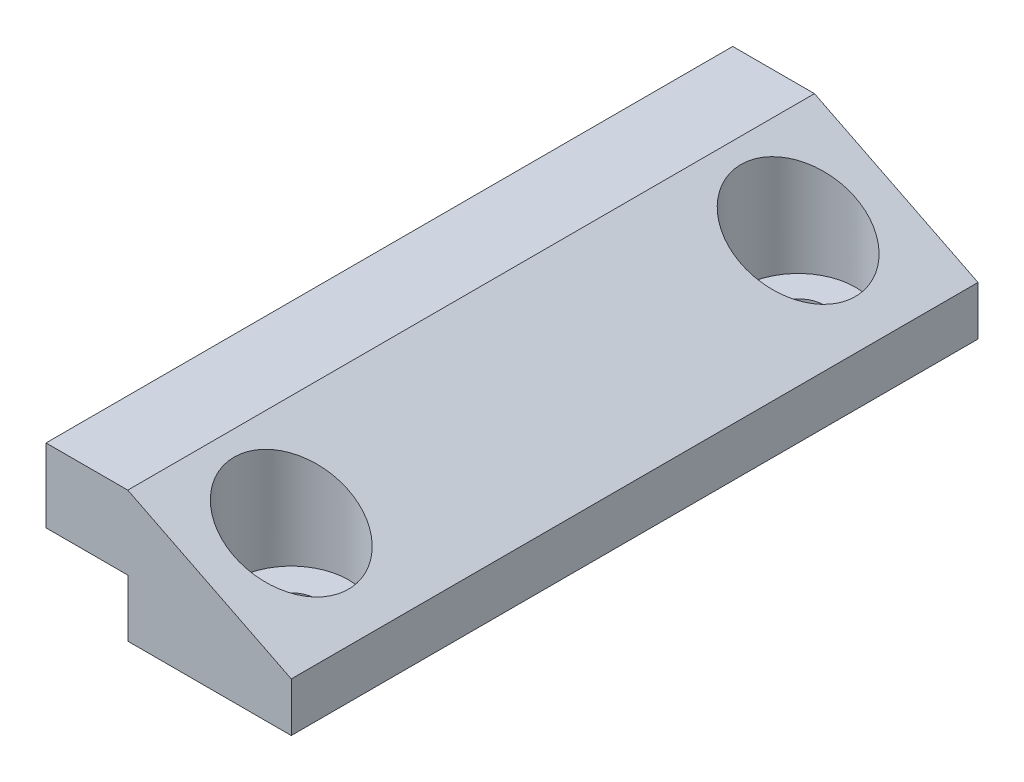
ISO-10303-21;
HEADER;
FILE_DESCRIPTION(('STEP AP214'),'2;1');
FILE_NAME('part.step','',(''),(''),'','','');
FILE_SCHEMA(('AUTOMOTIVE_DESIGN { 1 0 10303 214 1 1 1 1 }'));
ENDSEC;
DATA;
#1=APPLICATION_CONTEXT('core data for automotive mechanical design processes');
#2=APPLICATION_PROTOCOL_DEFINITION('international standard','automotive_design',2000,#1);
#3=PRODUCT_CONTEXT('',#1,'mechanical');
#4=PRODUCT('Part','Part','',(#3));
#5=PRODUCT_RELATED_PRODUCT_CATEGORY('part','',(#4));
#6=PRODUCT_DEFINITION_FORMATION('','',#4);
#7=PRODUCT_DEFINITION_CONTEXT('part definition',#1,'design');
#8=PRODUCT_DEFINITION('design','',#6,#7);
#9=PRODUCT_DEFINITION_SHAPE('','',#8);
#10=(LENGTH_UNIT() NAMED_UNIT(*) SI_UNIT(.MILLI.,.METRE.));
#11=(NAMED_UNIT(*) PLANE_ANGLE_UNIT() SI_UNIT($,.RADIAN.));
#12=(NAMED_UNIT(*) SI_UNIT($,.STERADIAN.) SOLID_ANGLE_UNIT());
#13=UNCERTAINTY_MEASURE_WITH_UNIT(LENGTH_MEASURE(1.E-05),#10,'distance_accuracy_value','');
#14=(GEOMETRIC_REPRESENTATION_CONTEXT(3) GLOBAL_UNCERTAINTY_ASSIGNED_CONTEXT((#13)) GLOBAL_UNIT_ASSIGNED_CONTEXT((#10,
#11,#12)) REPRESENTATION_CONTEXT('',''));
#15=CARTESIAN_POINT('',(0.,0.,0.));
#16=DIRECTION('',(0.,0.,1.));
#17=DIRECTION('',(1.,0.,0.));
#18=AXIS2_PLACEMENT_3D('',#15,#16,#17);
#19=CARTESIAN_POINT('',(9.5,-0.499999999999999,5.50000000000001));
#20=DIRECTION('',(0.,1.,0.));
#21=DIRECTION('',(0.,0.,1.));
#22=AXIS2_PLACEMENT_3D('',#19,#20,#21);
#23=CYLINDRICAL_SURFACE('',#22,3.5);
#24=CARTESIAN_POINT('',(9.5,5.75,5.50000000000001));
#25=DIRECTION('',(-0.447213595499958,-0.894427190999916,0.));
#26=DIRECTION('',(-0.894427190999916,0.447213595499958,0.));
#27=AXIS2_PLACEMENT_3D('',#24,#25,#26);
#28=ELLIPSE('',#27,3.91311896062463,3.5);
#29=CARTESIAN_POINT('',(6.,7.5,5.50000000000001));
#30=VERTEX_POINT('',#29);
#31=EDGE_CURVE('E144',#30,#30,#28,.F.);
#32=ORIENTED_EDGE('',*,*,#31,.T.);
#33=EDGE_LOOP('',(#32));
#34=FACE_BOUND('',#33,.T.);
#35=CARTESIAN_POINT('',(9.5,1.,5.50000000000001));
#36=DIRECTION('',(0.,-1.,0.));
#37=DIRECTION('',(0.,0.,-1.));
#38=AXIS2_PLACEMENT_3D('',#35,#36,#37);
#39=CIRCLE('',#38,3.5);
#40=CARTESIAN_POINT('',(9.5,1.,2.));
#41=VERTEX_POINT('',#40);
#42=EDGE_CURVE('E11',#41,#41,#39,.F.);
#43=ORIENTED_EDGE('',*,*,#42,.F.);
#44=EDGE_LOOP('',(#43));
#45=FACE_BOUND('',#44,.T.);
#46=ADVANCED_FACE('F32',(#34,#45),#23,.F.);
#47=CARTESIAN_POINT('',(9.5,-0.499999999999999,36.5));
#48=DIRECTION('',(0.,1.,0.));
#49=DIRECTION('',(0.,0.,1.));
#50=AXIS2_PLACEMENT_3D('',#47,#48,#49);
#51=CYLINDRICAL_SURFACE('',#50,3.5);
#52=CARTESIAN_POINT('',(9.5,5.75,36.5));
#53=DIRECTION('',(-0.447213595499958,-0.894427190999916,0.));
#54=DIRECTION('',(-0.894427190999916,0.447213595499958,0.));
#55=AXIS2_PLACEMENT_3D('',#52,#53,#54);
#56=ELLIPSE('',#55,3.91311896062463,3.5);
#57=CARTESIAN_POINT('',(6.,7.5,36.5));
#58=VERTEX_POINT('',#57);
#59=EDGE_CURVE('E142',#58,#58,#56,.F.);
#60=ORIENTED_EDGE('',*,*,#59,.T.);
#61=EDGE_LOOP('',(#60));
#62=FACE_BOUND('',#61,.T.);
#63=CARTESIAN_POINT('',(9.5,1.,36.5));
#64=DIRECTION('',(0.,-1.,0.));
#65=DIRECTION('',(0.,0.,-1.));
#66=AXIS2_PLACEMENT_3D('',#63,#64,#65);
#67=CIRCLE('',#66,3.5);
#68=CARTESIAN_POINT('',(9.5,1.,33.));
#69=VERTEX_POINT('',#68);
#70=EDGE_CURVE('E40',#69,#69,#67,.F.);
#71=ORIENTED_EDGE('',*,*,#70,.F.);
#72=EDGE_LOOP('',(#71));
#73=FACE_BOUND('',#72,.T.);
#74=ADVANCED_FACE('F150',(#62,#73),#51,.F.);
#75=CARTESIAN_POINT('',(15.,0.,42.));
#76=DIRECTION('',(-1.,0.,0.));
#77=DIRECTION('',(0.,0.,1.));
#78=AXIS2_PLACEMENT_3D('',#75,#76,#77);
#79=PLANE('',#78);
#80=DIRECTION('',(0.,1.,0.));
#81=VECTOR('',#80,1.);
#82=CARTESIAN_POINT('',(15.,0.,0.));
#83=LINE('',#82,#81);
#84=CARTESIAN_POINT('',(15.,0.,0.));
#85=VERTEX_POINT('',#84);
#86=CARTESIAN_POINT('',(15.,3.,0.));
#87=VERTEX_POINT('',#86);
#88=EDGE_CURVE('E123',#85,#87,#83,.T.);
#89=ORIENTED_EDGE('',*,*,#88,.T.);
#90=DIRECTION('',(0.,0.,1.));
#91=VECTOR('',#90,1.);
#92=CARTESIAN_POINT('',(15.,3.,-5.00000000000001));
#93=LINE('',#92,#91);
#94=CARTESIAN_POINT('',(15.,3.,42.));
#95=VERTEX_POINT('',#94);
#96=EDGE_CURVE('E47',#87,#95,#93,.T.);
#97=ORIENTED_EDGE('',*,*,#96,.T.);
#98=DIRECTION('',(0.,1.,0.));
#99=VECTOR('',#98,1.);
#100=CARTESIAN_POINT('',(15.,0.,42.));
#101=LINE('',#100,#99);
#102=CARTESIAN_POINT('',(15.,0.,42.));
#103=VERTEX_POINT('',#102);
#104=EDGE_CURVE('E135',#103,#95,#101,.T.);
#105=ORIENTED_EDGE('',*,*,#104,.F.);
#106=DIRECTION('',(0.,0.,-1.));
#107=VECTOR('',#106,1.);
#108=CARTESIAN_POINT('',(15.,0.,42.));
#109=LINE('',#108,#107);
#110=EDGE_CURVE('E119',#103,#85,#109,.T.);
#111=ORIENTED_EDGE('',*,*,#110,.T.);
#112=EDGE_LOOP('',(#89,#97,#105,#111));
#113=FACE_BOUND('',#112,.T.);
#114=ADVANCED_FACE('F34',(#113),#79,.F.);
#115=CARTESIAN_POINT('',(0.,8.,42.));
#116=DIRECTION('',(0.,-1.,0.));
#117=DIRECTION('',(0.,0.,-1.));
#118=AXIS2_PLACEMENT_3D('',#115,#116,#117);
#119=PLANE('',#118);
#120=DIRECTION('',(-1.,0.,0.));
#121=VECTOR('',#120,1.);
#122=CARTESIAN_POINT('',(0.,8.,42.));
#123=LINE('',#122,#121);
#124=CARTESIAN_POINT('',(5.,8.,42.));
#125=VERTEX_POINT('',#124);
#126=CARTESIAN_POINT('',(0.,8.,42.));
#127=VERTEX_POINT('',#126);
#128=EDGE_CURVE('E88',#125,#127,#123,.T.);
#129=ORIENTED_EDGE('',*,*,#128,.F.);
#130=DIRECTION('',(0.,0.,1.));
#131=VECTOR('',#130,1.);
#132=CARTESIAN_POINT('',(5.,8.,-5.00000000000001));
#133=LINE('',#132,#131);
#134=CARTESIAN_POINT('',(5.,8.,0.));
#135=VERTEX_POINT('',#134);
#136=EDGE_CURVE('E189',#135,#125,#133,.T.);
#137=ORIENTED_EDGE('',*,*,#136,.F.);
#138=DIRECTION('',(-1.,0.,0.));
#139=VECTOR('',#138,1.);
#140=CARTESIAN_POINT('',(0.,8.,0.));
#141=LINE('',#140,#139);
#142=CARTESIAN_POINT('',(0.,8.,0.));
#143=VERTEX_POINT('',#142);
#144=EDGE_CURVE('E126',#135,#143,#141,.T.);
#145=ORIENTED_EDGE('',*,*,#144,.T.);
#146=DIRECTION('',(0.,0.,-1.));
#147=VECTOR('',#146,1.);
#148=CARTESIAN_POINT('',(0.,8.,42.));
#149=LINE('',#148,#147);
#150=EDGE_CURVE('E139',#127,#143,#149,.T.);
#151=ORIENTED_EDGE('',*,*,#150,.F.);
#152=EDGE_LOOP('',(#129,#137,#145,#151));
#153=FACE_BOUND('',#152,.T.);
#154=ADVANCED_FACE('F158',(#153),#119,.F.);
#155=CARTESIAN_POINT('',(0.,3.5,42.));
#156=DIRECTION('',(1.,0.,0.));
#157=DIRECTION('',(0.,0.,-1.));
#158=AXIS2_PLACEMENT_3D('',#155,#156,#157);
#159=PLANE('',#158);
#160=DIRECTION('',(0.,-1.,0.));
#161=VECTOR('',#160,1.);
#162=CARTESIAN_POINT('',(0.,3.5,0.));
#163=LINE('',#162,#161);
#164=CARTESIAN_POINT('',(0.,3.5,0.));
#165=VERTEX_POINT('',#164);
#166=EDGE_CURVE('E129',#143,#165,#163,.T.);
#167=ORIENTED_EDGE('',*,*,#166,.T.);
#168=DIRECTION('',(0.,0.,-1.));
#169=VECTOR('',#168,1.);
#170=CARTESIAN_POINT('',(0.,3.5,42.));
#171=LINE('',#170,#169);
#172=CARTESIAN_POINT('',(0.,3.5,42.));
#173=VERTEX_POINT('',#172);
#174=EDGE_CURVE('E114',#173,#165,#171,.T.);
#175=ORIENTED_EDGE('',*,*,#174,.F.);
#176=DIRECTION('',(0.,-1.,0.));
#177=VECTOR('',#176,1.);
#178=CARTESIAN_POINT('',(0.,3.5,42.));
#179=LINE('',#178,#177);
#180=EDGE_CURVE('E102',#127,#173,#179,.T.);
#181=ORIENTED_EDGE('',*,*,#180,.F.);
#182=ORIENTED_EDGE('',*,*,#150,.T.);
#183=EDGE_LOOP('',(#167,#175,#181,#182));
#184=FACE_BOUND('',#183,.T.);
#185=ADVANCED_FACE('F179',(#184),#159,.F.);
#186=CARTESIAN_POINT('',(0.,3.5,42.));
#187=DIRECTION('',(0.,1.,0.));
#188=DIRECTION('',(0.,0.,1.));
#189=AXIS2_PLACEMENT_3D('',#186,#187,#188);
#190=PLANE('',#189);
#191=DIRECTION('',(1.,0.,0.));
#192=VECTOR('',#191,1.);
#193=CARTESIAN_POINT('',(0.,3.5,0.));
#194=LINE('',#193,#192);
#195=CARTESIAN_POINT('',(5.,3.5,0.));
#196=VERTEX_POINT('',#195);
#197=EDGE_CURVE('E111',#165,#196,#194,.T.);
#198=ORIENTED_EDGE('',*,*,#197,.T.);
#199=DIRECTION('',(0.,0.,-1.));
#200=VECTOR('',#199,1.);
#201=CARTESIAN_POINT('',(5.,3.5,42.));
#202=LINE('',#201,#200);
#203=CARTESIAN_POINT('',(5.,3.5,42.));
#204=VERTEX_POINT('',#203);
#205=EDGE_CURVE('E108',#204,#196,#202,.T.);
#206=ORIENTED_EDGE('',*,*,#205,.F.);
#207=DIRECTION('',(1.,0.,0.));
#208=VECTOR('',#207,1.);
#209=CARTESIAN_POINT('',(0.,3.5,42.));
#210=LINE('',#209,#208);
#211=EDGE_CURVE('E95',#173,#204,#210,.T.);
#212=ORIENTED_EDGE('',*,*,#211,.F.);
#213=ORIENTED_EDGE('',*,*,#174,.T.);
#214=EDGE_LOOP('',(#198,#206,#212,#213));
#215=FACE_BOUND('',#214,.T.);
#216=ADVANCED_FACE('F109',(#215),#190,.F.);
#217=CARTESIAN_POINT('',(5.,3.5,42.));
#218=DIRECTION('',(1.,0.,0.));
#219=DIRECTION('',(0.,0.,-1.));
#220=AXIS2_PLACEMENT_3D('',#217,#218,#219);
#221=PLANE('',#220);
#222=DIRECTION('',(0.,-1.,0.));
#223=VECTOR('',#222,1.);
#224=CARTESIAN_POINT('',(5.,3.5,0.));
#225=LINE('',#224,#223);
#226=CARTESIAN_POINT('',(5.,0.,0.));
#227=VERTEX_POINT('',#226);
#228=EDGE_CURVE('E132',#196,#227,#225,.T.);
#229=ORIENTED_EDGE('',*,*,#228,.T.);
#230=DIRECTION('',(0.,0.,-1.));
#231=VECTOR('',#230,1.);
#232=CARTESIAN_POINT('',(5.,0.,42.));
#233=LINE('',#232,#231);
#234=CARTESIAN_POINT('',(5.,0.,42.));
#235=VERTEX_POINT('',#234);
#236=EDGE_CURVE('E115',#235,#227,#233,.T.);
#237=ORIENTED_EDGE('',*,*,#236,.F.);
#238=DIRECTION('',(0.,-1.,0.));
#239=VECTOR('',#238,1.);
#240=CARTESIAN_POINT('',(5.,3.5,42.));
#241=LINE('',#240,#239);
#242=EDGE_CURVE('E99',#204,#235,#241,.T.);
#243=ORIENTED_EDGE('',*,*,#242,.F.);
#244=ORIENTED_EDGE('',*,*,#205,.T.);
#245=EDGE_LOOP('',(#229,#237,#243,#244));
#246=FACE_BOUND('',#245,.T.);
#247=ADVANCED_FACE('F117',(#246),#221,.F.);
#248=CARTESIAN_POINT('',(5.,0.,42.));
#249=DIRECTION('',(0.,1.,0.));
#250=DIRECTION('',(0.,0.,1.));
#251=AXIS2_PLACEMENT_3D('',#248,#249,#250);
#252=PLANE('',#251);
#253=DIRECTION('',(1.,0.,0.));
#254=VECTOR('',#253,1.);
#255=CARTESIAN_POINT('',(5.,0.,0.));
#256=LINE('',#255,#254);
#257=EDGE_CURVE('E80',#227,#85,#256,.T.);
#258=ORIENTED_EDGE('',*,*,#257,.T.);
#259=ORIENTED_EDGE('',*,*,#110,.F.);
#260=DIRECTION('',(1.,0.,0.));
#261=VECTOR('',#260,1.);
#262=CARTESIAN_POINT('',(5.,0.,42.));
#263=LINE('',#262,#261);
#264=EDGE_CURVE('E56',#235,#103,#263,.T.);
#265=ORIENTED_EDGE('',*,*,#264,.F.);
#266=ORIENTED_EDGE('',*,*,#236,.T.);
#267=EDGE_LOOP('',(#258,#259,#265,#266));
#268=FACE_BOUND('',#267,.T.);
#269=CARTESIAN_POINT('',(9.5,0.,36.5));
#270=DIRECTION('',(0.,-1.,0.));
#271=DIRECTION('',(0.,0.,-1.));
#272=AXIS2_PLACEMENT_3D('',#269,#270,#271);
#273=CIRCLE('',#272,1.5);
#274=CARTESIAN_POINT('',(9.5,0.,35.));
#275=VERTEX_POINT('',#274);
#276=EDGE_CURVE('E204',#275,#275,#273,.T.);
#277=ORIENTED_EDGE('',*,*,#276,.F.);
#278=EDGE_LOOP('',(#277));
#279=FACE_BOUND('',#278,.T.);
#280=CARTESIAN_POINT('',(9.5,0.,5.50000000000001));
#281=DIRECTION('',(0.,-1.,0.));
#282=DIRECTION('',(0.,0.,-1.));
#283=AXIS2_PLACEMENT_3D('',#280,#281,#282);
#284=CIRCLE('',#283,1.6);
#285=CARTESIAN_POINT('',(9.5,0.,3.9));
#286=VERTEX_POINT('',#285);
#287=EDGE_CURVE('E210',#286,#286,#284,.T.);
#288=ORIENTED_EDGE('',*,*,#287,.F.);
#289=EDGE_LOOP('',(#288));
#290=FACE_BOUND('',#289,.T.);
#291=ADVANCED_FACE('F169',(#268,#279,#290),#252,.F.);
#292=CARTESIAN_POINT('',(0.,0.,42.));
#293=DIRECTION('',(0.,0.,-1.));
#294=DIRECTION('',(-1.,0.,0.));
#295=AXIS2_PLACEMENT_3D('',#292,#293,#294);
#296=PLANE('',#295);
#297=ORIENTED_EDGE('',*,*,#104,.T.);
#298=DIRECTION('',(0.894427190999916,-0.447213595499958,0.));
#299=VECTOR('',#298,1.);
#300=CARTESIAN_POINT('',(5.,8.,42.));
#301=LINE('',#300,#299);
#302=EDGE_CURVE('E200',#125,#95,#301,.T.);
#303=ORIENTED_EDGE('',*,*,#302,.F.);
#304=ORIENTED_EDGE('',*,*,#128,.T.);
#305=ORIENTED_EDGE('',*,*,#180,.T.);
#306=ORIENTED_EDGE('',*,*,#211,.T.);
#307=ORIENTED_EDGE('',*,*,#242,.T.);
#308=ORIENTED_EDGE('',*,*,#264,.T.);
#309=EDGE_LOOP('',(#297,#303,#304,#305,#306,#307,#308));
#310=FACE_BOUND('',#309,.T.);
#311=ADVANCED_FACE('F97',(#310),#296,.F.);
#312=CARTESIAN_POINT('',(0.,0.,0.));
#313=DIRECTION('',(0.,0.,-1.));
#314=DIRECTION('',(-1.,0.,0.));
#315=AXIS2_PLACEMENT_3D('',#312,#313,#314);
#316=PLANE('',#315);
#317=DIRECTION('',(-0.894427190999916,0.447213595499958,0.));
#318=VECTOR('',#317,1.);
#319=CARTESIAN_POINT('',(4.2,8.4,0.));
#320=LINE('',#319,#318);
#321=EDGE_CURVE('E127',#87,#135,#320,.T.);
#322=ORIENTED_EDGE('',*,*,#321,.F.);
#323=ORIENTED_EDGE('',*,*,#88,.F.);
#324=ORIENTED_EDGE('',*,*,#257,.F.);
#325=ORIENTED_EDGE('',*,*,#228,.F.);
#326=ORIENTED_EDGE('',*,*,#197,.F.);
#327=ORIENTED_EDGE('',*,*,#166,.F.);
#328=ORIENTED_EDGE('',*,*,#144,.F.);
#329=EDGE_LOOP('',(#322,#323,#324,#325,#326,#327,#328));
#330=FACE_BOUND('',#329,.T.);
#331=ADVANCED_FACE('F168',(#330),#316,.T.);
#332=CARTESIAN_POINT('',(5.,8.,-5.00000000000001));
#333=DIRECTION('',(-0.447213595499958,-0.894427190999916,0.));
#334=DIRECTION('',(0.894427190999916,-0.447213595499958,0.));
#335=AXIS2_PLACEMENT_3D('',#332,#333,#334);
#336=PLANE('',#335);
#337=ORIENTED_EDGE('',*,*,#321,.T.);
#338=ORIENTED_EDGE('',*,*,#136,.T.);
#339=ORIENTED_EDGE('',*,*,#302,.T.);
#340=ORIENTED_EDGE('',*,*,#96,.F.);
#341=EDGE_LOOP('',(#337,#338,#339,#340));
#342=FACE_BOUND('',#341,.T.);
#343=ORIENTED_EDGE('',*,*,#59,.F.);
#344=EDGE_LOOP('',(#343));
#345=FACE_BOUND('',#344,.T.);
#346=ORIENTED_EDGE('',*,*,#31,.F.);
#347=EDGE_LOOP('',(#346));
#348=FACE_BOUND('',#347,.T.);
#349=ADVANCED_FACE('F163',(#342,#345,#348),#336,.F.);
#350=CARTESIAN_POINT('',(9.5,1.,36.5));
#351=DIRECTION('',(0.,-1.,0.));
#352=DIRECTION('',(0.,0.,-1.));
#353=AXIS2_PLACEMENT_3D('',#350,#351,#352);
#354=PLANE('',#353);
#355=CARTESIAN_POINT('',(9.5,1.,36.5));
#356=DIRECTION('',(0.,-1.,0.));
#357=DIRECTION('',(0.,0.,-1.));
#358=AXIS2_PLACEMENT_3D('',#355,#356,#357);
#359=CIRCLE('',#358,1.5);
#360=CARTESIAN_POINT('',(9.5,1.,35.));
#361=VERTEX_POINT('',#360);
#362=EDGE_CURVE('E203',#361,#361,#359,.T.);
#363=ORIENTED_EDGE('',*,*,#362,.T.);
#364=EDGE_LOOP('',(#363));
#365=FACE_BOUND('',#364,.T.);
#366=ORIENTED_EDGE('',*,*,#70,.T.);
#367=EDGE_LOOP('',(#366));
#368=FACE_BOUND('',#367,.T.);
#369=ADVANCED_FACE('F148',(#365,#368),#354,.F.);
#370=CARTESIAN_POINT('',(9.5,1.,36.5));
#371=DIRECTION('',(0.,-1.,0.));
#372=DIRECTION('',(0.,0.,-1.));
#373=AXIS2_PLACEMENT_3D('',#370,#371,#372);
#374=CYLINDRICAL_SURFACE('',#373,1.5);
#375=ORIENTED_EDGE('',*,*,#362,.F.);
#376=EDGE_LOOP('',(#375));
#377=FACE_BOUND('',#376,.T.);
#378=ORIENTED_EDGE('',*,*,#276,.T.);
#379=EDGE_LOOP('',(#378));
#380=FACE_BOUND('',#379,.T.);
#381=ADVANCED_FACE('F228',(#377,#380),#374,.F.);
#382=CARTESIAN_POINT('',(9.5,1.,5.50000000000001));
#383=DIRECTION('',(0.,-1.,0.));
#384=DIRECTION('',(0.,0.,-1.));
#385=AXIS2_PLACEMENT_3D('',#382,#383,#384);
#386=PLANE('',#385);
#387=CARTESIAN_POINT('',(9.5,1.,5.50000000000001));
#388=DIRECTION('',(0.,-1.,0.));
#389=DIRECTION('',(0.,0.,-1.));
#390=AXIS2_PLACEMENT_3D('',#387,#388,#389);
#391=CIRCLE('',#390,1.6);
#392=CARTESIAN_POINT('',(9.5,1.,3.9));
#393=VERTEX_POINT('',#392);
#394=EDGE_CURVE('E207',#393,#393,#391,.T.);
#395=ORIENTED_EDGE('',*,*,#394,.T.);
#396=EDGE_LOOP('',(#395));
#397=FACE_BOUND('',#396,.T.);
#398=ORIENTED_EDGE('',*,*,#42,.T.);
#399=EDGE_LOOP('',(#398));
#400=FACE_BOUND('',#399,.T.);
#401=ADVANCED_FACE('F216',(#397,#400),#386,.F.);
#402=CARTESIAN_POINT('',(9.5,1.,5.50000000000001));
#403=DIRECTION('',(0.,-1.,0.));
#404=DIRECTION('',(0.,0.,-1.));
#405=AXIS2_PLACEMENT_3D('',#402,#403,#404);
#406=CYLINDRICAL_SURFACE('',#405,1.6);
#407=ORIENTED_EDGE('',*,*,#394,.F.);
#408=EDGE_LOOP('',(#407));
#409=FACE_BOUND('',#408,.T.);
#410=ORIENTED_EDGE('',*,*,#287,.T.);
#411=EDGE_LOOP('',(#410));
#412=FACE_BOUND('',#411,.T.);
#413=ADVANCED_FACE('F219',(#409,#412),#406,.F.);
#414=CLOSED_SHELL('',(#46,#74,#114,#154,#185,#216,#247,#291,#311,#331,#349,#369,#381,#401,#413));
#415=MANIFOLD_SOLID_BREP('B2',#414);
#416=ADVANCED_BREP_SHAPE_REPRESENTATION('',(#18,#415),#14);
#417=SHAPE_DEFINITION_REPRESENTATION(#9,#416);
ENDSEC;
END-ISO-10303-21;
